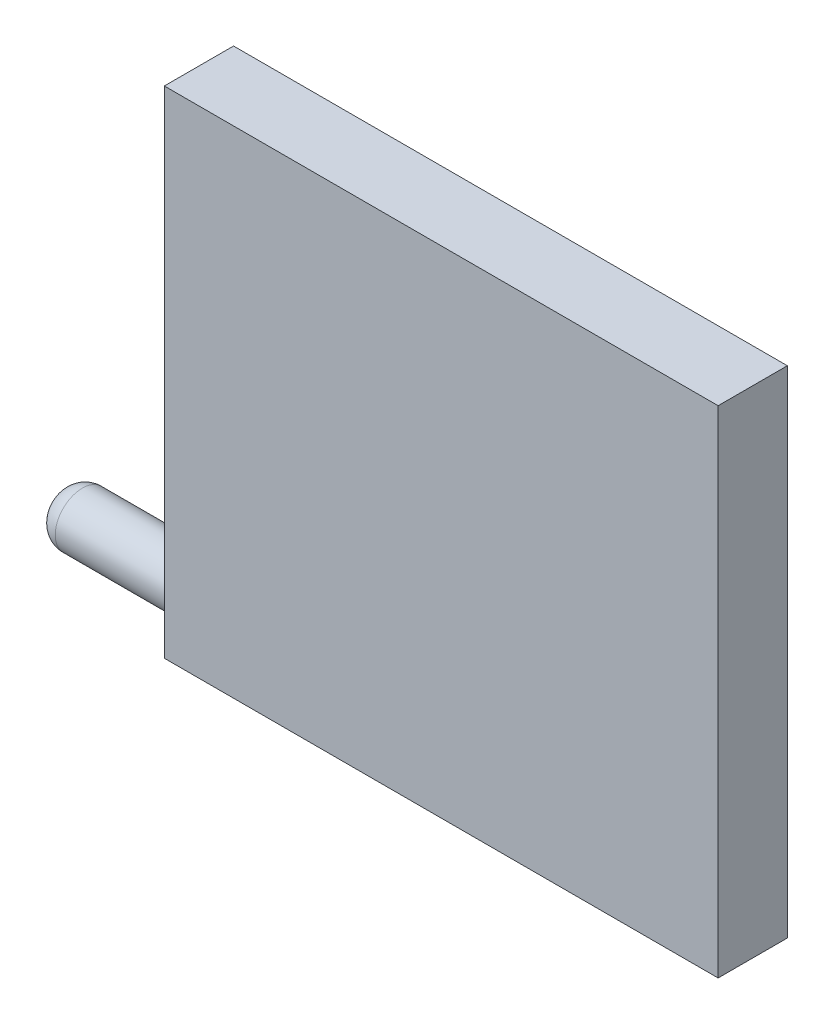
ISO-10303-21;
HEADER;
FILE_DESCRIPTION(('STEP AP214'),'2;1');
FILE_NAME('part.step','',(''),(''),'','','');
FILE_SCHEMA(('AUTOMOTIVE_DESIGN { 1 0 10303 214 1 1 1 1 }'));
ENDSEC;
DATA;
#1=APPLICATION_CONTEXT('core data for automotive mechanical design processes');
#2=APPLICATION_PROTOCOL_DEFINITION('international standard','automotive_design',2000,#1);
#3=PRODUCT_CONTEXT('',#1,'mechanical');
#4=PRODUCT('Part','Part','',(#3));
#5=PRODUCT_RELATED_PRODUCT_CATEGORY('part','',(#4));
#6=PRODUCT_DEFINITION_FORMATION('','',#4);
#7=PRODUCT_DEFINITION_CONTEXT('part definition',#1,'design');
#8=PRODUCT_DEFINITION('design','',#6,#7);
#9=PRODUCT_DEFINITION_SHAPE('','',#8);
#10=(LENGTH_UNIT() NAMED_UNIT(*) SI_UNIT(.MILLI.,.METRE.));
#11=(NAMED_UNIT(*) PLANE_ANGLE_UNIT() SI_UNIT($,.RADIAN.));
#12=(NAMED_UNIT(*) SI_UNIT($,.STERADIAN.) SOLID_ANGLE_UNIT());
#13=UNCERTAINTY_MEASURE_WITH_UNIT(LENGTH_MEASURE(1.E-05),#10,'distance_accuracy_value','');
#14=(GEOMETRIC_REPRESENTATION_CONTEXT(3) GLOBAL_UNCERTAINTY_ASSIGNED_CONTEXT((#13)) GLOBAL_UNIT_ASSIGNED_CONTEXT((#10,
#11,#12)) REPRESENTATION_CONTEXT('',''));
#15=CARTESIAN_POINT('',(0.,0.,0.));
#16=DIRECTION('',(0.,0.,1.));
#17=DIRECTION('',(1.,0.,0.));
#18=AXIS2_PLACEMENT_3D('',#15,#16,#17);
#19=CARTESIAN_POINT('',(0.,0.,10.));
#20=DIRECTION('',(1.,0.,0.));
#21=DIRECTION('',(0.,0.,-1.));
#22=AXIS2_PLACEMENT_3D('',#19,#20,#21);
#23=PLANE('',#22);
#24=CARTESIAN_POINT('',(0.,-65.2994565184043,4.84922945777501));
#25=DIRECTION('',(1.,0.,0.));
#26=DIRECTION('',(0.,0.,-1.));
#27=AXIS2_PLACEMENT_3D('',#24,#25,#26);
#28=CIRCLE('',#27,3.90971140949538);
#29=CARTESIAN_POINT('',(0.,-65.2994565184043,0.939518048279625));
#30=VERTEX_POINT('',#29);
#31=EDGE_CURVE('E128',#30,#30,#28,.F.);
#32=ORIENTED_EDGE('',*,*,#31,.F.);
#33=EDGE_LOOP('',(#32));
#34=FACE_BOUND('',#33,.T.);
#35=DIRECTION('',(0.,-1.,0.));
#36=VECTOR('',#35,1.);
#37=CARTESIAN_POINT('',(0.,0.,0.));
#38=LINE('',#37,#36);
#39=CARTESIAN_POINT('',(0.,0.,0.));
#40=VERTEX_POINT('',#39);
#41=CARTESIAN_POINT('',(0.,-71.5973741794311,0.));
#42=VERTEX_POINT('',#41);
#43=EDGE_CURVE('E112',#40,#42,#38,.T.);
#44=ORIENTED_EDGE('',*,*,#43,.T.);
#45=DIRECTION('',(0.,0.,-1.));
#46=VECTOR('',#45,1.);
#47=CARTESIAN_POINT('',(0.,-71.5973741794311,10.));
#48=LINE('',#47,#46);
#49=CARTESIAN_POINT('',(0.,-71.5973741794311,10.));
#50=VERTEX_POINT('',#49);
#51=EDGE_CURVE('E101',#50,#42,#48,.T.);
#52=ORIENTED_EDGE('',*,*,#51,.F.);
#53=DIRECTION('',(0.,-1.,0.));
#54=VECTOR('',#53,1.);
#55=CARTESIAN_POINT('',(0.,0.,10.));
#56=LINE('',#55,#54);
#57=CARTESIAN_POINT('',(0.,0.,10.));
#58=VERTEX_POINT('',#57);
#59=EDGE_CURVE('E93',#58,#50,#56,.T.);
#60=ORIENTED_EDGE('',*,*,#59,.F.);
#61=DIRECTION('',(0.,0.,-1.));
#62=VECTOR('',#61,1.);
#63=CARTESIAN_POINT('',(0.,0.,10.));
#64=LINE('',#63,#62);
#65=EDGE_CURVE('E108',#58,#40,#64,.T.);
#66=ORIENTED_EDGE('',*,*,#65,.T.);
#67=EDGE_LOOP('',(#44,#52,#60,#66));
#68=FACE_BOUND('',#67,.T.);
#69=ADVANCED_FACE('F39',(#34,#68),#23,.F.);
#70=CARTESIAN_POINT('',(0.,-71.5973741794311,10.));
#71=DIRECTION('',(0.,1.,0.));
#72=DIRECTION('',(0.,0.,1.));
#73=AXIS2_PLACEMENT_3D('',#70,#71,#72);
#74=PLANE('',#73);
#75=DIRECTION('',(1.,0.,0.));
#76=VECTOR('',#75,1.);
#77=CARTESIAN_POINT('',(0.,-71.5973741794311,0.));
#78=LINE('',#77,#76);
#79=CARTESIAN_POINT('',(80.,-71.5973741794311,0.));
#80=VERTEX_POINT('',#79);
#81=EDGE_CURVE('E99',#42,#80,#78,.T.);
#82=ORIENTED_EDGE('',*,*,#81,.T.);
#83=DIRECTION('',(0.,0.,-1.));
#84=VECTOR('',#83,1.);
#85=CARTESIAN_POINT('',(80.,-71.5973741794311,10.));
#86=LINE('',#85,#84);
#87=CARTESIAN_POINT('',(80.,-71.5973741794311,10.));
#88=VERTEX_POINT('',#87);
#89=EDGE_CURVE('E97',#88,#80,#86,.T.);
#90=ORIENTED_EDGE('',*,*,#89,.F.);
#91=DIRECTION('',(1.,0.,0.));
#92=VECTOR('',#91,1.);
#93=CARTESIAN_POINT('',(0.,-71.5973741794311,10.));
#94=LINE('',#93,#92);
#95=EDGE_CURVE('E88',#50,#88,#94,.T.);
#96=ORIENTED_EDGE('',*,*,#95,.F.);
#97=ORIENTED_EDGE('',*,*,#51,.T.);
#98=EDGE_LOOP('',(#82,#90,#96,#97));
#99=FACE_BOUND('',#98,.T.);
#100=ADVANCED_FACE('F98',(#99),#74,.F.);
#101=CARTESIAN_POINT('',(80.,0.,10.));
#102=DIRECTION('',(-1.,0.,0.));
#103=DIRECTION('',(0.,0.,1.));
#104=AXIS2_PLACEMENT_3D('',#101,#102,#103);
#105=PLANE('',#104);
#106=DIRECTION('',(0.,1.,0.));
#107=VECTOR('',#106,1.);
#108=CARTESIAN_POINT('',(80.,0.,0.));
#109=LINE('',#108,#107);
#110=CARTESIAN_POINT('',(80.,0.,0.));
#111=VERTEX_POINT('',#110);
#112=EDGE_CURVE('E74',#80,#111,#109,.T.);
#113=ORIENTED_EDGE('',*,*,#112,.T.);
#114=DIRECTION('',(0.,0.,-1.));
#115=VECTOR('',#114,1.);
#116=CARTESIAN_POINT('',(80.,0.,10.));
#117=LINE('',#116,#115);
#118=CARTESIAN_POINT('',(80.,0.,10.));
#119=VERTEX_POINT('',#118);
#120=EDGE_CURVE('E102',#119,#111,#117,.T.);
#121=ORIENTED_EDGE('',*,*,#120,.F.);
#122=DIRECTION('',(0.,1.,0.));
#123=VECTOR('',#122,1.);
#124=CARTESIAN_POINT('',(80.,0.,10.));
#125=LINE('',#124,#123);
#126=EDGE_CURVE('E91',#88,#119,#125,.T.);
#127=ORIENTED_EDGE('',*,*,#126,.F.);
#128=ORIENTED_EDGE('',*,*,#89,.T.);
#129=EDGE_LOOP('',(#113,#121,#127,#128));
#130=FACE_BOUND('',#129,.T.);
#131=ADVANCED_FACE('F104',(#130),#105,.F.);
#132=CARTESIAN_POINT('',(0.,0.,10.));
#133=DIRECTION('',(0.,-1.,0.));
#134=DIRECTION('',(0.,0.,-1.));
#135=AXIS2_PLACEMENT_3D('',#132,#133,#134);
#136=PLANE('',#135);
#137=DIRECTION('',(-1.,0.,0.));
#138=VECTOR('',#137,1.);
#139=CARTESIAN_POINT('',(0.,0.,0.));
#140=LINE('',#139,#138);
#141=EDGE_CURVE('E80',#111,#40,#140,.T.);
#142=ORIENTED_EDGE('',*,*,#141,.T.);
#143=ORIENTED_EDGE('',*,*,#65,.F.);
#144=DIRECTION('',(-1.,0.,0.));
#145=VECTOR('',#144,1.);
#146=CARTESIAN_POINT('',(0.,0.,10.));
#147=LINE('',#146,#145);
#148=EDGE_CURVE('E57',#119,#58,#147,.T.);
#149=ORIENTED_EDGE('',*,*,#148,.F.);
#150=ORIENTED_EDGE('',*,*,#120,.T.);
#151=EDGE_LOOP('',(#142,#143,#149,#150));
#152=FACE_BOUND('',#151,.T.);
#153=ADVANCED_FACE('F156',(#152),#136,.F.);
#154=CARTESIAN_POINT('',(0.,0.,10.));
#155=DIRECTION('',(0.,0.,1.));
#156=DIRECTION('',(1.,0.,0.));
#157=AXIS2_PLACEMENT_3D('',#154,#155,#156);
#158=PLANE('',#157);
#159=ORIENTED_EDGE('',*,*,#59,.T.);
#160=ORIENTED_EDGE('',*,*,#95,.T.);
#161=ORIENTED_EDGE('',*,*,#126,.T.);
#162=ORIENTED_EDGE('',*,*,#148,.T.);
#163=EDGE_LOOP('',(#159,#160,#161,#162));
#164=FACE_BOUND('',#163,.T.);
#165=ADVANCED_FACE('F89',(#164),#158,.T.);
#166=CARTESIAN_POINT('',(0.,0.,0.));
#167=DIRECTION('',(0.,0.,1.));
#168=DIRECTION('',(1.,0.,0.));
#169=AXIS2_PLACEMENT_3D('',#166,#167,#168);
#170=PLANE('',#169);
#171=ORIENTED_EDGE('',*,*,#43,.F.);
#172=ORIENTED_EDGE('',*,*,#141,.F.);
#173=ORIENTED_EDGE('',*,*,#112,.F.);
#174=ORIENTED_EDGE('',*,*,#81,.F.);
#175=EDGE_LOOP('',(#171,#172,#173,#174));
#176=FACE_BOUND('',#175,.T.);
#177=ADVANCED_FACE('F159',(#176),#170,.F.);
#178=CARTESIAN_POINT('',(-20.,-65.2994565184043,4.84922945777501));
#179=DIRECTION('',(1.,0.,0.));
#180=DIRECTION('',(0.,0.,-1.));
#181=AXIS2_PLACEMENT_3D('',#178,#179,#180);
#182=CYLINDRICAL_SURFACE('',#181,3.90971140949538);
#183=CARTESIAN_POINT('',(-17.,-65.2994565184043,4.84922945777501));
#184=DIRECTION('',(-1.,0.,0.));
#185=DIRECTION('',(0.,0.,1.));
#186=AXIS2_PLACEMENT_3D('',#183,#184,#185);
#187=CIRCLE('',#186,3.90971140949538);
#188=CARTESIAN_POINT('',(-17.,-65.2994565184043,8.75894086727039));
#189=VERTEX_POINT('',#188);
#190=EDGE_CURVE('E11',#189,#189,#187,.F.);
#191=ORIENTED_EDGE('',*,*,#190,.T.);
#192=EDGE_LOOP('',(#191));
#193=FACE_BOUND('',#192,.T.);
#194=ORIENTED_EDGE('',*,*,#31,.T.);
#195=EDGE_LOOP('',(#194));
#196=FACE_BOUND('',#195,.T.);
#197=ADVANCED_FACE('F142',(#193,#196),#182,.T.);
#198=CARTESIAN_POINT('',(-20.,-65.2994565184043,4.84922945777501));
#199=DIRECTION('',(-1.,0.,0.));
#200=DIRECTION('',(0.,0.,1.));
#201=AXIS2_PLACEMENT_3D('',#198,#199,#200);
#202=PLANE('',#201);
#203=CARTESIAN_POINT('',(-20.,-65.2994565184043,4.84922945777501));
#204=DIRECTION('',(-1.,0.,0.));
#205=DIRECTION('',(0.,0.,1.));
#206=AXIS2_PLACEMENT_3D('',#203,#204,#205);
#207=CIRCLE('',#206,0.909711409495383);
#208=CARTESIAN_POINT('',(-20.,-65.2994565184043,5.75894086727039));
#209=VERTEX_POINT('',#208);
#210=EDGE_CURVE('E49',#209,#209,#207,.T.);
#211=ORIENTED_EDGE('',*,*,#210,.T.);
#212=EDGE_LOOP('',(#211));
#213=FACE_BOUND('',#212,.T.);
#214=ADVANCED_FACE('F135',(#213),#202,.T.);
#215=CARTESIAN_POINT('',(-17.,-65.2994565184043,4.84922945777501));
#216=DIRECTION('',(-1.,0.,0.));
#217=DIRECTION('',(0.,0.,1.));
#218=AXIS2_PLACEMENT_3D('',#215,#216,#217);
#219=DEGENERATE_TOROIDAL_SURFACE('',#218,0.909711409495383,3.,.T.);
#220=ORIENTED_EDGE('',*,*,#190,.F.);
#221=EDGE_LOOP('',(#220));
#222=FACE_BOUND('',#221,.T.);
#223=ORIENTED_EDGE('',*,*,#210,.F.);
#224=EDGE_LOOP('',(#223));
#225=FACE_BOUND('',#224,.T.);
#226=ADVANCED_FACE('F41',(#222,#225),#219,.T.);
#227=CLOSED_SHELL('',(#69,#100,#131,#153,#165,#177,#197,#214,#226));
#228=MANIFOLD_SOLID_BREP('B2',#227);
#229=ADVANCED_BREP_SHAPE_REPRESENTATION('',(#18,#228),#14);
#230=SHAPE_DEFINITION_REPRESENTATION(#9,#229);
ENDSEC;
END-ISO-10303-21;
